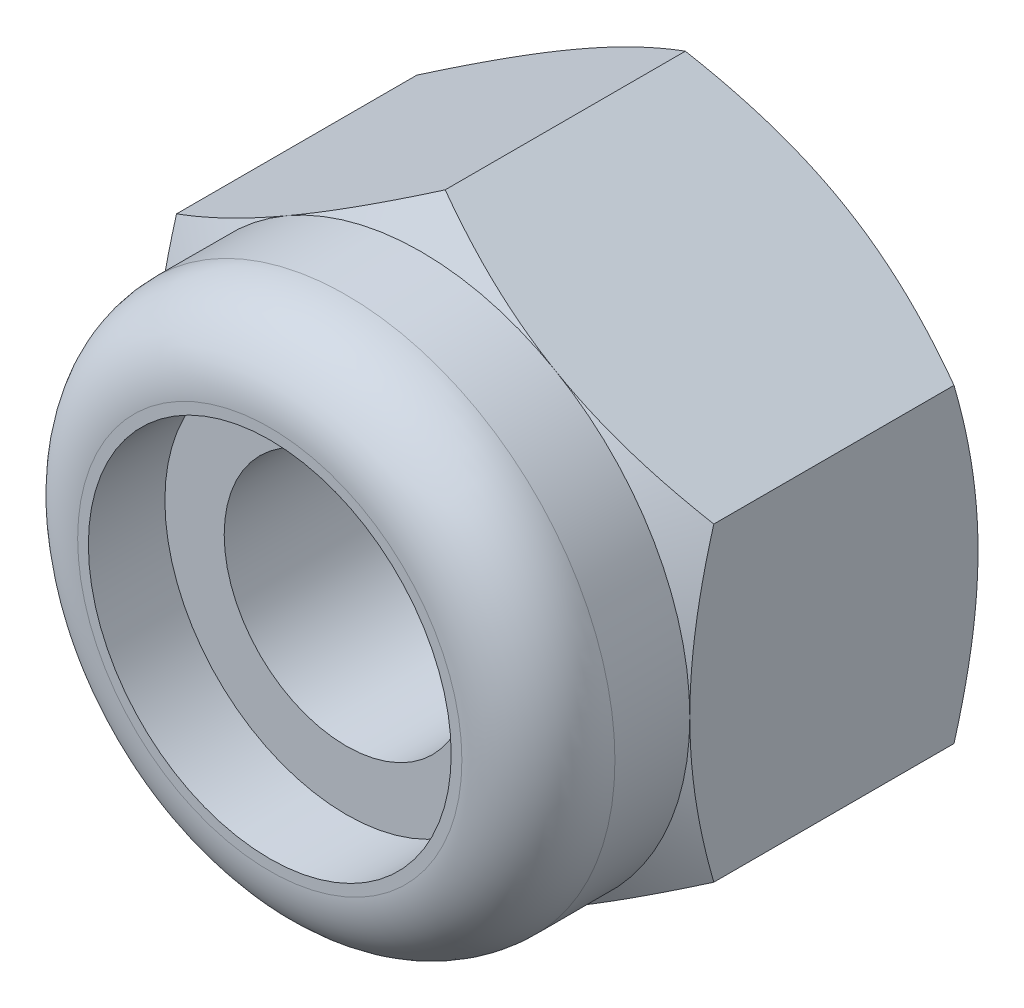
ISO-10303-21;
HEADER;
FILE_DESCRIPTION(('STEP AP214'),'2;1');
FILE_NAME('part.step','',(''),(''),'','','');
FILE_SCHEMA(('AUTOMOTIVE_DESIGN { 1 0 10303 214 1 1 1 1 }'));
ENDSEC;
DATA;
#1=APPLICATION_CONTEXT('core data for automotive mechanical design processes');
#2=APPLICATION_PROTOCOL_DEFINITION('international standard','automotive_design',2000,#1);
#3=PRODUCT_CONTEXT('',#1,'mechanical');
#4=PRODUCT('Part','Part','',(#3));
#5=PRODUCT_RELATED_PRODUCT_CATEGORY('part','',(#4));
#6=PRODUCT_DEFINITION_FORMATION('','',#4);
#7=PRODUCT_DEFINITION_CONTEXT('part definition',#1,'design');
#8=PRODUCT_DEFINITION('design','',#6,#7);
#9=PRODUCT_DEFINITION_SHAPE('','',#8);
#10=(LENGTH_UNIT() NAMED_UNIT(*) SI_UNIT(.MILLI.,.METRE.));
#11=(NAMED_UNIT(*) PLANE_ANGLE_UNIT() SI_UNIT($,.RADIAN.));
#12=(NAMED_UNIT(*) SI_UNIT($,.STERADIAN.) SOLID_ANGLE_UNIT());
#13=UNCERTAINTY_MEASURE_WITH_UNIT(LENGTH_MEASURE(1.E-05),#10,'distance_accuracy_value','');
#14=(GEOMETRIC_REPRESENTATION_CONTEXT(3) GLOBAL_UNCERTAINTY_ASSIGNED_CONTEXT((#13)) GLOBAL_UNIT_ASSIGNED_CONTEXT((#10,
#11,#12)) REPRESENTATION_CONTEXT('',''));
#15=CARTESIAN_POINT('',(0.,0.,0.));
#16=DIRECTION('',(0.,0.,1.));
#17=DIRECTION('',(1.,0.,0.));
#18=AXIS2_PLACEMENT_3D('',#15,#16,#17);
#19=CARTESIAN_POINT('',(0.,0.,-2.15));
#20=DIRECTION('',(0.,0.,1.));
#21=DIRECTION('',(1.,0.,0.));
#22=AXIS2_PLACEMENT_3D('',#19,#20,#21);
#23=CYLINDRICAL_SURFACE('',#22,1.25);
#24=CARTESIAN_POINT('',(0.,0.,1.56666666666667));
#25=DIRECTION('',(0.,0.,1.));
#26=DIRECTION('',(1.,0.,0.));
#27=AXIS2_PLACEMENT_3D('',#24,#25,#26);
#28=CIRCLE('',#27,1.25);
#29=CARTESIAN_POINT('',(1.25,0.,1.56666666666667));
#30=VERTEX_POINT('',#29);
#31=EDGE_CURVE('E389',#30,#30,#28,.T.);
#32=ORIENTED_EDGE('',*,*,#31,.T.);
#33=EDGE_LOOP('',(#32));
#34=FACE_BOUND('',#33,.T.);
#35=CARTESIAN_POINT('',(0.,0.,-1.94954811544757));
#36=DIRECTION('',(0.,0.,-1.));
#37=DIRECTION('',(-1.,0.,0.));
#38=AXIS2_PLACEMENT_3D('',#35,#36,#37);
#39=CIRCLE('',#38,1.25);
#40=CARTESIAN_POINT('',(-1.25,0.,-1.94954811544757));
#41=VERTEX_POINT('',#40);
#42=EDGE_CURVE('E207',#41,#41,#39,.F.);
#43=ORIENTED_EDGE('',*,*,#42,.F.);
#44=EDGE_LOOP('',(#43));
#45=FACE_BOUND('',#44,.T.);
#46=ADVANCED_FACE('F45',(#34,#45),#23,.F.);
#47=CARTESIAN_POINT('',(0.,3.17542648054295,-2.15));
#48=DIRECTION('',(-0.5,0.866025403784438,0.));
#49=DIRECTION('',(-0.866025403784438,-0.5,0.));
#50=AXIS2_PLACEMENT_3D('',#47,#48,#49);
#51=PLANE('',#50);
#52=DIRECTION('',(0.,0.,1.));
#53=VECTOR('',#52,1.);
#54=CARTESIAN_POINT('',(-2.75,1.58771324027147,-2.15));
#55=LINE('',#54,#53);
#56=CARTESIAN_POINT('',(-2.75,1.58771324027148,-1.90437990693813));
#57=VERTEX_POINT('',#56);
#58=CARTESIAN_POINT('',(-2.75,1.58771324027147,0.554379906938138));
#59=VERTEX_POINT('',#58);
#60=EDGE_CURVE('E193',#57,#59,#55,.T.);
#61=ORIENTED_EDGE('',*,*,#60,.T.);
#62=CARTESIAN_POINT('',(-2.75,1.58771324027147,0.554379906938139));
#63=CARTESIAN_POINT('',(-2.6302066308482,1.6568759741984,0.594329737139828));
#64=CARTESIAN_POINT('',(-2.509365846914,1.72664343333189,0.630689842069858));
#65=CARTESIAN_POINT('',(-2.26662688052022,1.86678884092215,0.6939946691019));
#66=CARTESIAN_POINT('',(-2.14473934279069,1.93716064364116,0.720994395558883));
#67=CARTESIAN_POINT('',(-1.96071790577701,2.04340546983767,0.753166760880289));
#68=CARTESIAN_POINT('',(-1.89913099491315,2.07896268940348,0.762507004192575));
#69=CARTESIAN_POINT('',(-1.77567051838129,2.15024262876342,0.778194151320093));
#70=CARTESIAN_POINT('',(-1.71379695842668,2.18596534525894,0.784541114539224));
#71=CARTESIAN_POINT('',(-1.58949771719198,2.25772954564586,0.794106782080544));
#72=CARTESIAN_POINT('',(-1.52707094038672,2.29377166203902,0.797306663931051));
#73=CARTESIAN_POINT('',(-1.4021432417576,2.36589870247178,0.800446474149509));
#74=CARTESIAN_POINT('',(-1.33964230713022,2.4019836339035,0.800385718731819));
#75=CARTESIAN_POINT('',(-1.27717330955858,2.4380501264675,0.798661103323475));
#76=B_SPLINE_CURVE_WITH_KNOTS('',3,(#62,#63,#64,#65,#66,#67,#68,#69,#70,#71,#72,#73,#74,#75),
.UNSPECIFIED.,.F.,.F.,(4,2,2,2,2,2,4),(0.,0.432153638556045,0.861722968635905,1.07684052373622,
1.29195380948689,1.50834598747679,1.72478354507502),.UNSPECIFIED.);
#77=CARTESIAN_POINT('',(-1.37500000000867,2.3815698604022,0.799999999999999));
#78=VERTEX_POINT('',#77);
#79=EDGE_CURVE('E221',#59,#78,#76,.T.);
#80=ORIENTED_EDGE('',*,*,#79,.T.);
#81=CARTESIAN_POINT('',(0.,3.17542648054295,0.554379906938137));
#82=CARTESIAN_POINT('',(-0.1197933691518,3.10626374661602,0.594329737139826));
#83=CARTESIAN_POINT('',(-0.240634153085997,3.03649628748253,0.630689842069857));
#84=CARTESIAN_POINT('',(-0.483373119479775,2.89635087989227,0.693994669101898));
#85=CARTESIAN_POINT('',(-0.605260657209305,2.82597907717326,0.720994395558882));
#86=CARTESIAN_POINT('',(-0.789282094222992,2.71973425097675,0.753166760880288));
#87=CARTESIAN_POINT('',(-0.850869005086854,2.68417703141094,0.762507004192574));
#88=CARTESIAN_POINT('',(-0.974329481618705,2.612897092051,0.778194151320092));
#89=CARTESIAN_POINT('',(-1.03620304157332,2.57717437555548,0.784541114539224));
#90=CARTESIAN_POINT('',(-1.16050228280802,2.50541017516856,0.794106782080543));
#91=CARTESIAN_POINT('',(-1.22292905961328,2.4693680587754,0.797306663931051));
#92=CARTESIAN_POINT('',(-1.3478567582424,2.39724101834264,0.800446474149509));
#93=CARTESIAN_POINT('',(-1.41035769286978,2.36115608691092,0.800385718731819));
#94=CARTESIAN_POINT('',(-1.47282669044143,2.32508959434692,0.798661103323475));
#95=B_SPLINE_CURVE_WITH_KNOTS('',3,(#81,#82,#83,#84,#85,#86,#87,#88,#89,#90,#91,#92,#93,#94),
.UNSPECIFIED.,.F.,.F.,(4,2,2,2,2,2,4),(0.,0.432153638556046,0.861722968635908,1.07684052373623,
1.29195380948689,1.50834598747679,1.72478354507502),.UNSPECIFIED.);
#96=CARTESIAN_POINT('',(0.,3.17542648054295,0.554379906938135));
#97=VERTEX_POINT('',#96);
#98=EDGE_CURVE('E368',#78,#97,#95,.F.);
#99=ORIENTED_EDGE('',*,*,#98,.T.);
#100=DIRECTION('',(0.,0.,1.));
#101=VECTOR('',#100,1.);
#102=CARTESIAN_POINT('',(0.,3.17542648054295,-2.15));
#103=LINE('',#102,#101);
#104=CARTESIAN_POINT('',(0.,3.17542648054295,-1.90437990693813));
#105=VERTEX_POINT('',#104);
#106=EDGE_CURVE('E173',#105,#97,#103,.T.);
#107=ORIENTED_EDGE('',*,*,#106,.F.);
#108=CARTESIAN_POINT('',(-2.7502,1.58759777021763,-1.90431323663524));
#109=CARTESIAN_POINT('',(-2.6293507793401,1.65737010029699,-1.94461233775074));
#110=CARTESIAN_POINT('',(-2.50745839737737,1.72774469983533,-1.98126309740234));
#111=CARTESIAN_POINT('',(-2.26156287327211,1.86971254687003,-2.0452378170302));
#112=CARTESIAN_POINT('',(-2.13755536142615,1.94130831721583,-2.0725391443255));
#113=CARTESIAN_POINT('',(-1.89107720202406,2.08361254889599,-2.11503825470588));
#114=CARTESIAN_POINT('',(-1.76864448141258,2.15429911309864,-2.13051888137754));
#115=CARTESIAN_POINT('',(-1.52320285763109,2.29600490065923,-2.14900060263006));
#116=CARTESIAN_POINT('',(-1.40019484676709,2.36702360884404,-2.1520170005374));
#117=CARTESIAN_POINT('',(-1.17034121338921,2.49972966594897,-2.14574685457145));
#118=CARTESIAN_POINT('',(-1.06346120874598,2.56143686540073,-2.1379998457233));
#119=CARTESIAN_POINT('',(-0.850397532665251,2.68444923614047,-2.11344481893564));
#120=CARTESIAN_POINT('',(-0.744214598351111,2.74575398185008,-2.09662841034943));
#121=CARTESIAN_POINT('',(-0.530711510606815,2.86902004703207,-2.05458807765404));
#122=CARTESIAN_POINT('',(-0.423418383857144,2.93096576264319,-2.02918591931277));
#123=CARTESIAN_POINT('',(-0.210432520715947,3.05393320806134,-1.97153277416002));
#124=CARTESIAN_POINT('',(-0.104737054973346,3.11495651365996,-1.93929533670101));
#125=CARTESIAN_POINT('',(0.000200000000000757,3.17554195059679,-1.90431323663523));
#126=B_SPLINE_CURVE_WITH_KNOTS('',3,(#108,#109,#110,#111,#112,#113,#114,#115,#116,#117,#118,
#119,#120,#121,#122,#123,#124,#125),.UNSPECIFIED.,.F.,.F.,(4,2,2,2,2,2,2,2,4),(0.,
0.435912828725888,0.872873557116332,1.29901931904672,1.72464171213574,2.09526089052938,
2.46622354066375,2.84541551798558,3.22386274754525),.UNSPECIFIED.);
#127=CARTESIAN_POINT('',(-1.375,2.38156986040721,-2.15));
#128=VERTEX_POINT('',#127);
#129=EDGE_CURVE('E197',#128,#105,#126,.T.);
#130=ORIENTED_EDGE('',*,*,#129,.F.);
#131=EDGE_CURVE('E164',#57,#128,#126,.T.);
#132=ORIENTED_EDGE('',*,*,#131,.F.);
#133=EDGE_LOOP('',(#61,#80,#99,#107,#130,#132));
#134=FACE_BOUND('',#133,.T.);
#135=ADVANCED_FACE('F306',(#134),#51,.T.);
#136=CARTESIAN_POINT('',(2.75,1.58771324027146,-2.15));
#137=DIRECTION('',(0.5,0.866025403784438,0.));
#138=DIRECTION('',(-0.866025403784438,0.5,0.));
#139=AXIS2_PLACEMENT_3D('',#136,#137,#138);
#140=PLANE('',#139);
#141=ORIENTED_EDGE('',*,*,#106,.T.);
#142=CARTESIAN_POINT('',(0.,3.17542648054294,0.554379906938142));
#143=CARTESIAN_POINT('',(0.119793369151802,3.10626374661601,0.594329737139832));
#144=CARTESIAN_POINT('',(0.240634153085998,3.03649628748252,0.630689842069862));
#145=CARTESIAN_POINT('',(0.483373119479775,2.89635087989226,0.693994669101903));
#146=CARTESIAN_POINT('',(0.605260657209305,2.82597907717325,0.720994395558886));
#147=CARTESIAN_POINT('',(0.78928209422299,2.71973425097674,0.753166760880292));
#148=CARTESIAN_POINT('',(0.850869005086852,2.68417703141093,0.762507004192578));
#149=CARTESIAN_POINT('',(0.974329481618702,2.61289709205099,0.778194151320096));
#150=CARTESIAN_POINT('',(1.03620304157331,2.57717437555548,0.784541114539227));
#151=CARTESIAN_POINT('',(1.16050228280802,2.50541017516855,0.794106782080547));
#152=CARTESIAN_POINT('',(1.22292905961328,2.46936805877539,0.797306663931055));
#153=CARTESIAN_POINT('',(1.34785675824239,2.39724101834264,0.800446474149513));
#154=CARTESIAN_POINT('',(1.41035769286978,2.36115608691091,0.800385718731822));
#155=CARTESIAN_POINT('',(1.47282669044142,2.32508959434692,0.798661103323479));
#156=B_SPLINE_CURVE_WITH_KNOTS('',3,(#142,#143,#144,#145,#146,#147,#148,#149,#150,#151,#152,
#153,#154,#155),.UNSPECIFIED.,.F.,.F.,(4,2,2,2,2,2,4),(0.,0.432153638556044,0.861722968635903,
1.07684052373622,1.29195380948689,1.50834598747678,1.72478354507501),.UNSPECIFIED.);
#157=CARTESIAN_POINT('',(1.375,2.3815698604072,0.800000000000001));
#158=VERTEX_POINT('',#157);
#159=EDGE_CURVE('E371',#97,#158,#156,.T.);
#160=ORIENTED_EDGE('',*,*,#159,.T.);
#161=CARTESIAN_POINT('',(2.75,1.58771324027147,0.554379906938142));
#162=CARTESIAN_POINT('',(2.63020663084819,1.65687597419839,0.594329737139832));
#163=CARTESIAN_POINT('',(2.509365846914,1.72664343333189,0.630689842069862));
#164=CARTESIAN_POINT('',(2.26662688052022,1.86678884092214,0.693994669101903));
#165=CARTESIAN_POINT('',(2.14473934279069,1.93716064364115,0.720994395558887));
#166=CARTESIAN_POINT('',(1.96071790577701,2.04340546983766,0.753166760880292));
#167=CARTESIAN_POINT('',(1.89913099491314,2.07896268940347,0.762507004192578));
#168=CARTESIAN_POINT('',(1.77567051838129,2.15024262876341,0.778194151320096));
#169=CARTESIAN_POINT('',(1.71379695842668,2.18596534525893,0.784541114539227));
#170=CARTESIAN_POINT('',(1.58949771719198,2.25772954564585,0.794106782080547));
#171=CARTESIAN_POINT('',(1.52707094038672,2.29377166203901,0.797306663931055));
#172=CARTESIAN_POINT('',(1.4021432417576,2.36589870247177,0.800446474149513));
#173=CARTESIAN_POINT('',(1.33964230713022,2.40198363390349,0.800385718731822));
#174=CARTESIAN_POINT('',(1.27717330955858,2.43805012646749,0.798661103323479));
#175=B_SPLINE_CURVE_WITH_KNOTS('',3,(#161,#162,#163,#164,#165,#166,#167,#168,#169,#170,#171,
#172,#173,#174),.UNSPECIFIED.,.F.,.F.,(4,2,2,2,2,2,4),(0.,0.432153638556044,0.861722968635903,
1.07684052373622,1.29195380948688,1.50834598747678,1.72478354507501),.UNSPECIFIED.);
#176=CARTESIAN_POINT('',(2.75,1.58771324027146,0.554379906938139));
#177=VERTEX_POINT('',#176);
#178=EDGE_CURVE('E171',#158,#177,#175,.F.);
#179=ORIENTED_EDGE('',*,*,#178,.T.);
#180=DIRECTION('',(0.,0.,1.));
#181=VECTOR('',#180,1.);
#182=CARTESIAN_POINT('',(2.75,1.58771324027146,-2.15));
#183=LINE('',#182,#181);
#184=CARTESIAN_POINT('',(2.75,1.58771324027148,-1.90437990693813));
#185=VERTEX_POINT('',#184);
#186=EDGE_CURVE('E160',#185,#177,#183,.T.);
#187=ORIENTED_EDGE('',*,*,#186,.F.);
#188=CARTESIAN_POINT('',(-0.000199999999999,3.17554195059679,-1.90431323663523));
#189=CARTESIAN_POINT('',(0.120649220659904,3.10576962051743,-1.94461233775074));
#190=CARTESIAN_POINT('',(0.242541602622631,3.03539502097908,-1.98126309740234));
#191=CARTESIAN_POINT('',(0.488437126727889,2.89342717394438,-2.0452378170302));
#192=CARTESIAN_POINT('',(0.612444638573852,2.82183140359858,-2.0725391443255));
#193=CARTESIAN_POINT('',(0.858922797975941,2.67952717191842,-2.11503825470589));
#194=CARTESIAN_POINT('',(0.981355518587415,2.60884060771577,-2.13051888137755));
#195=CARTESIAN_POINT('',(1.22679714236891,2.46713482015518,-2.14900060263006));
#196=CARTESIAN_POINT('',(1.34980515323291,2.39611611197037,-2.1520170005374));
#197=CARTESIAN_POINT('',(1.57965878661079,2.26341005486544,-2.14574685457145));
#198=CARTESIAN_POINT('',(1.68653879125402,2.20170285541368,-2.1379998457233));
#199=CARTESIAN_POINT('',(1.89960246733475,2.07869048467394,-2.11344481893565));
#200=CARTESIAN_POINT('',(2.00578540164889,2.01738573896433,-2.09662841034943));
#201=CARTESIAN_POINT('',(2.21928848939318,1.89411967378234,-2.05458807765405));
#202=CARTESIAN_POINT('',(2.32658161614285,1.83217395817122,-2.02918591931277));
#203=CARTESIAN_POINT('',(2.53956747928405,1.70920651275307,-1.97153277416002));
#204=CARTESIAN_POINT('',(2.64526294502665,1.64818320715446,-1.93929533670102));
#205=CARTESIAN_POINT('',(2.7502,1.58759777021763,-1.90431323663524));
#206=B_SPLINE_CURVE_WITH_KNOTS('',3,(#188,#189,#190,#191,#192,#193,#194,#195,#196,#197,#198,
#199,#200,#201,#202,#203,#204,#205),.UNSPECIFIED.,.F.,.F.,(4,2,2,2,2,2,2,2,4),(0.,
0.43591282872589,0.872873557116335,1.29901931904672,1.72464171213574,2.09526089052938,
2.46622354066375,2.84541551798558,3.22386274754525),.UNSPECIFIED.);
#207=CARTESIAN_POINT('',(1.375,2.38156986040721,-2.15));
#208=VERTEX_POINT('',#207);
#209=EDGE_CURVE('E140',#208,#185,#206,.T.);
#210=ORIENTED_EDGE('',*,*,#209,.F.);
#211=EDGE_CURVE('E152',#105,#208,#206,.T.);
#212=ORIENTED_EDGE('',*,*,#211,.F.);
#213=EDGE_LOOP('',(#141,#160,#179,#187,#210,#212));
#214=FACE_BOUND('',#213,.T.);
#215=ADVANCED_FACE('F168',(#214),#140,.T.);
#216=CARTESIAN_POINT('',(2.75,1.58771324027146,-2.15));
#217=DIRECTION('',(-1.,0.,0.));
#218=DIRECTION('',(0.,0.,1.));
#219=AXIS2_PLACEMENT_3D('',#216,#217,#218);
#220=PLANE('',#219);
#221=CARTESIAN_POINT('',(2.75,-1.58771324027148,0.554379906938137));
#222=CARTESIAN_POINT('',(2.75,-1.44938777241763,0.594329737139828));
#223=CARTESIAN_POINT('',(2.75,-1.30985285415064,0.630689842069858));
#224=CARTESIAN_POINT('',(2.75,-1.02956203897012,0.693994669101899));
#225=CARTESIAN_POINT('',(2.75,-0.888818433532111,0.720994395558882));
#226=CARTESIAN_POINT('',(2.75,-0.676328781139084,0.753166760880289));
#227=CARTESIAN_POINT('',(2.75,-0.605214342007468,0.762507004192575));
#228=CARTESIAN_POINT('',(2.75,-0.462654463287581,0.778194151320093));
#229=CARTESIAN_POINT('',(2.75,-0.391209030296551,0.784541114539224));
#230=CARTESIAN_POINT('',(2.75,-0.247680629522705,0.794106782080544));
#231=CARTESIAN_POINT('',(2.75,-0.17559639673639,0.797306663931052));
#232=CARTESIAN_POINT('',(2.75,-0.0313423158708706,0.80044647414951));
#233=CARTESIAN_POINT('',(2.75,0.0408275469925773,0.80038571873182));
#234=CARTESIAN_POINT('',(2.75,0.112960532120567,0.798661103323477));
#235=B_SPLINE_CURVE_WITH_KNOTS('',3,(#221,#222,#223,#224,#225,#226,#227,#228,#229,#230,#231,
#232,#233,#234),.UNSPECIFIED.,.F.,.F.,(4,2,2,2,2,2,4),(0.,0.432153638556045,0.861722968635905,
1.07684052373622,1.29195380948689,1.50834598747678,1.72478354507502),.UNSPECIFIED.);
#236=CARTESIAN_POINT('',(2.75,-1.58771324027148,0.554379906938135));
#237=VERTEX_POINT('',#236);
#238=CARTESIAN_POINT('',(2.75,0.,0.8));
#239=VERTEX_POINT('',#238);
#240=EDGE_CURVE('E213',#237,#239,#235,.T.);
#241=ORIENTED_EDGE('',*,*,#240,.F.);
#242=DIRECTION('',(0.,0.,1.));
#243=VECTOR('',#242,1.);
#244=CARTESIAN_POINT('',(2.75,-1.58771324027148,-2.15));
#245=LINE('',#244,#243);
#246=CARTESIAN_POINT('',(2.75,-1.58771324027147,-1.90437990693813));
#247=VERTEX_POINT('',#246);
#248=EDGE_CURVE('E174',#247,#237,#245,.T.);
#249=ORIENTED_EDGE('',*,*,#248,.F.);
#250=CARTESIAN_POINT('',(2.75,-4.21084949309676,-0.834051560397058));
#251=CARTESIAN_POINT('',(2.75,-4.09010894214091,-0.892400063847755));
#252=CARTESIAN_POINT('',(2.75,-3.9690829206551,-0.950168534882412));
#253=CARTESIAN_POINT('',(2.75,-3.72630558284844,-1.06421396157695));
#254=CARTESIAN_POINT('',(2.75,-3.60455414536201,-1.12049065899753));
#255=CARTESIAN_POINT('',(2.75,-3.35951393034355,-1.23151755664724));
#256=CARTESIAN_POINT('',(2.75,-3.23622034236437,-1.28625717839416));
#257=CARTESIAN_POINT('',(2.75,-2.98861980138744,-1.39338522252354));
#258=CARTESIAN_POINT('',(2.75,-2.86431290161182,-1.44577376746323));
#259=CARTESIAN_POINT('',(2.75,-2.61294485887172,-1.54819642785387));
#260=CARTESIAN_POINT('',(2.75,-2.48586863815655,-1.59819374210161));
#261=CARTESIAN_POINT('',(2.75,-2.23021732171541,-1.6942725912154));
#262=CARTESIAN_POINT('',(2.75,-2.10164206103364,-1.74035369042303));
#263=CARTESIAN_POINT('',(2.75,-1.84305218799468,-1.82736192295377));
#264=CARTESIAN_POINT('',(2.75,-1.71304130052584,-1.86830001358611));
#265=CARTESIAN_POINT('',(2.75,-1.45117125062148,-1.94369269237565));
#266=CARTESIAN_POINT('',(2.75,-1.31931268690203,-1.97814933084723));
#267=CARTESIAN_POINT('',(2.75,-1.05365722480013,-2.03890632846909));
#268=CARTESIAN_POINT('',(2.75,-0.919859820217595,-2.06520451590488));
#269=CARTESIAN_POINT('',(2.75,-0.650651874037385,-2.10787396280339));
#270=CARTESIAN_POINT('',(2.75,-0.515241331013598,-2.12424521348946));
#271=CARTESIAN_POINT('',(2.75,-0.244373242869214,-2.14561250345976));
#272=CARTESIAN_POINT('',(2.75,-0.108921526377136,-2.15068055677322));
#273=CARTESIAN_POINT('',(2.75,0.161887058855131,-2.14917220436733));
#274=CARTESIAN_POINT('',(2.75,0.297243943089638,-2.14259882131445));
#275=CARTESIAN_POINT('',(2.75,0.52838543671754,-2.12189586995316));
#276=CARTESIAN_POINT('',(2.75,0.624425050137498,-2.11046235896981));
#277=CARTESIAN_POINT('',(2.75,0.815762399811541,-2.08247828038665));
#278=CARTESIAN_POINT('',(2.75,0.911060016631964,-2.06592690577232));
#279=CARTESIAN_POINT('',(2.75,1.19576218748916,-2.00946463872172));
#280=CARTESIAN_POINT('',(2.75,1.38383224738496,-1.96276014058271));
#281=CARTESIAN_POINT('',(2.75,1.66525048947485,-1.88220750296942));
#282=CARTESIAN_POINT('',(2.75,1.76006556248558,-1.8531966650045));
#283=CARTESIAN_POINT('',(2.75,1.94870609382215,-1.79230435109341));
#284=CARTESIAN_POINT('',(2.75,2.04253218553696,-1.7604248551215));
#285=CARTESIAN_POINT('',(2.75,2.22880240354984,-1.69445858181355));
#286=CARTESIAN_POINT('',(2.75,2.32125133588451,-1.66038523854447));
#287=CARTESIAN_POINT('',(2.75,2.50543192042628,-1.59023863176889));
#288=CARTESIAN_POINT('',(2.75,2.59716326539579,-1.55416455996268));
#289=CARTESIAN_POINT('',(2.75,2.68856293053345,-1.51728755800251));
#290=B_SPLINE_CURVE_WITH_KNOTS('',3,(#250,#251,#252,#253,#254,#255,#256,#257,#258,#259,#260,
#261,#262,#263,#264,#265,#266,#267,#268,#269,#270,#271,#272,#273,#274,#275,#276,#277,#278,#279,
#280,#281,#282,#283,#284,#285,#286,#287,#288,#289),.UNSPECIFIED.,.F.,.F.,(4,2,2,2,2,2,2,2,2,2,2,
2,2,2,2,2,2,2,2,4),(0.,0.402305607365937,0.804680408536998,1.20935783819118,1.61401414820819,
2.0236383818577,2.43330812457349,2.84208969479601,3.25074173456637,3.65950246109144,
4.06826354901184,4.47441284024651,4.88045669141172,5.17046846817546,5.46052599902453,
6.04107275309884,6.33851131304662,6.63574613017455,6.93130791005793,7.22698998004823),.UNSPECIFIED.);
#291=CARTESIAN_POINT('',(2.75,0.,-2.15));
#292=VERTEX_POINT('',#291);
#293=EDGE_CURVE('E162',#247,#292,#290,.T.);
#294=ORIENTED_EDGE('',*,*,#293,.T.);
#295=EDGE_CURVE('E143',#292,#185,#290,.T.);
#296=ORIENTED_EDGE('',*,*,#295,.T.);
#297=ORIENTED_EDGE('',*,*,#186,.T.);
#298=CARTESIAN_POINT('',(2.75,1.58771324027146,0.554379906938142));
#299=CARTESIAN_POINT('',(2.75,1.44938777241761,0.594329737139832));
#300=CARTESIAN_POINT('',(2.75,1.30985285415062,0.630689842069862));
#301=CARTESIAN_POINT('',(2.75,1.02956203897011,0.693994669101902));
#302=CARTESIAN_POINT('',(2.75,0.888818433532096,0.720994395558885));
#303=CARTESIAN_POINT('',(2.75,0.67632878113907,0.753166760880291));
#304=CARTESIAN_POINT('',(2.75,0.605214342007454,0.762507004192577));
#305=CARTESIAN_POINT('',(2.75,0.462654463287567,0.778194151320095));
#306=CARTESIAN_POINT('',(2.75,0.391209030296538,0.784541114539225));
#307=CARTESIAN_POINT('',(2.75,0.247680629522692,0.794106782080545));
#308=CARTESIAN_POINT('',(2.75,0.175596396736377,0.797306663931052));
#309=CARTESIAN_POINT('',(2.75,0.0313423158708582,0.80044647414951));
#310=CARTESIAN_POINT('',(2.75,-0.0408275469925895,0.80038571873182));
#311=CARTESIAN_POINT('',(2.75,-0.112960532120579,0.798661103323476));
#312=B_SPLINE_CURVE_WITH_KNOTS('',3,(#298,#299,#300,#301,#302,#303,#304,#305,#306,#307,#308,
#309,#310,#311),.UNSPECIFIED.,.F.,.F.,(4,2,2,2,2,2,4),(0.,0.432153638556043,0.861722968635902,
1.07684052373622,1.29195380948688,1.50834598747678,1.72478354507501),.UNSPECIFIED.);
#313=EDGE_CURVE('E247',#239,#177,#312,.F.);
#314=ORIENTED_EDGE('',*,*,#313,.F.);
#315=EDGE_LOOP('',(#241,#249,#294,#296,#297,#314));
#316=FACE_BOUND('',#315,.T.);
#317=ADVANCED_FACE('F158',(#316),#220,.F.);
#318=CARTESIAN_POINT('',(0.,-3.17542648054296,-2.15));
#319=DIRECTION('',(0.5,-0.866025403784438,0.));
#320=DIRECTION('',(0.866025403784438,0.5,0.));
#321=AXIS2_PLACEMENT_3D('',#318,#319,#320);
#322=PLANE('',#321);
#323=ORIENTED_EDGE('',*,*,#248,.T.);
#324=CARTESIAN_POINT('',(2.75,-1.58771324027148,0.554379906938137));
#325=CARTESIAN_POINT('',(2.63020663084819,-1.65687597419841,0.594329737139827));
#326=CARTESIAN_POINT('',(2.509365846914,-1.7266434333319,0.630689842069856));
#327=CARTESIAN_POINT('',(2.26662688052022,-1.86678884092216,0.693994669101897));
#328=CARTESIAN_POINT('',(2.14473934279069,-1.93716064364117,0.720994395558879));
#329=CARTESIAN_POINT('',(1.960717905777,-2.04340546983768,0.753166760880285));
#330=CARTESIAN_POINT('',(1.89913099491314,-2.07896268940349,0.762507004192571));
#331=CARTESIAN_POINT('',(1.77567051838129,-2.15024262876343,0.778194151320089));
#332=CARTESIAN_POINT('',(1.71379695842668,-2.18596534525895,0.78454111453922));
#333=CARTESIAN_POINT('',(1.58949771719198,-2.25772954564587,0.794106782080539));
#334=CARTESIAN_POINT('',(1.52707094038672,-2.29377166203903,0.797306663931046));
#335=CARTESIAN_POINT('',(1.4021432417576,-2.36589870247179,0.800446474149504));
#336=CARTESIAN_POINT('',(1.33964230713022,-2.40198363390351,0.800385718731813));
#337=CARTESIAN_POINT('',(1.27717330955857,-2.43805012646751,0.79866110332347));
#338=B_SPLINE_CURVE_WITH_KNOTS('',3,(#324,#325,#326,#327,#328,#329,#330,#331,#332,#333,#334,
#335,#336,#337),.UNSPECIFIED.,.F.,.F.,(4,2,2,2,2,2,4),(0.,0.432153638556045,0.861722968635906,
1.07684052373622,1.29195380948689,1.50834598747679,1.72478354507502),.UNSPECIFIED.);
#339=CARTESIAN_POINT('',(1.375,-2.38156986040721,0.799999999999997));
#340=VERTEX_POINT('',#339);
#341=EDGE_CURVE('E222',#237,#340,#338,.T.);
#342=ORIENTED_EDGE('',*,*,#341,.T.);
#343=CARTESIAN_POINT('',(0.,-3.17542648054296,0.554379906938133));
#344=CARTESIAN_POINT('',(0.119793369151805,-3.10626374661603,0.594329737139822));
#345=CARTESIAN_POINT('',(0.240634153086002,-3.03649628748253,0.630689842069852));
#346=CARTESIAN_POINT('',(0.48337311947978,-2.89635087989227,0.693994669101894));
#347=CARTESIAN_POINT('',(0.605260657209311,-2.82597907717327,0.720994395558878));
#348=CARTESIAN_POINT('',(0.789282094222997,-2.71973425097676,0.753166760880283));
#349=CARTESIAN_POINT('',(0.85086900508686,-2.68417703141095,0.762507004192569));
#350=CARTESIAN_POINT('',(0.974329481618711,-2.612897092051,0.778194151320087));
#351=CARTESIAN_POINT('',(1.03620304157332,-2.57717437555549,0.784541114539218));
#352=CARTESIAN_POINT('',(1.16050228280803,-2.50541017516856,0.794106782080538));
#353=CARTESIAN_POINT('',(1.22292905961329,-2.46936805877541,0.797306663931046));
#354=CARTESIAN_POINT('',(1.3478567582424,-2.39724101834265,0.800446474149504));
#355=CARTESIAN_POINT('',(1.41035769286979,-2.36115608691092,0.800385718731813));
#356=CARTESIAN_POINT('',(1.47282669044143,-2.32508959434693,0.79866110332347));
#357=B_SPLINE_CURVE_WITH_KNOTS('',3,(#343,#344,#345,#346,#347,#348,#349,#350,#351,#352,#353,
#354,#355,#356),.UNSPECIFIED.,.F.,.F.,(4,2,2,2,2,2,4),(0.,0.432153638556046,0.861722968635908,
1.07684052373623,1.29195380948689,1.50834598747679,1.72478354507502),.UNSPECIFIED.);
#358=CARTESIAN_POINT('',(0.,-3.17542648054296,0.55437990693813));
#359=VERTEX_POINT('',#358);
#360=EDGE_CURVE('E748',#340,#359,#357,.F.);
#361=ORIENTED_EDGE('',*,*,#360,.T.);
#362=DIRECTION('',(0.,0.,1.));
#363=VECTOR('',#362,1.);
#364=CARTESIAN_POINT('',(0.,-3.17542648054296,-2.15));
#365=LINE('',#364,#363);
#366=CARTESIAN_POINT('',(0.,-3.17542648054295,-1.90437990693813));
#367=VERTEX_POINT('',#366);
#368=EDGE_CURVE('E183',#367,#359,#365,.T.);
#369=ORIENTED_EDGE('',*,*,#368,.F.);
#370=CARTESIAN_POINT('',(2.7502,-1.58759777021764,-1.90431323663523));
#371=CARTESIAN_POINT('',(2.6293507793401,-1.657370100297,-1.94461233775073));
#372=CARTESIAN_POINT('',(2.50745839737737,-1.72774469983534,-1.98126309740233));
#373=CARTESIAN_POINT('',(2.26156287327211,-1.86971254687004,-2.04523781703019));
#374=CARTESIAN_POINT('',(2.13755536142615,-1.94130831721584,-2.0725391443255));
#375=CARTESIAN_POINT('',(1.89107720202406,-2.083612548896,-2.11503825470588));
#376=CARTESIAN_POINT('',(1.76864448141258,-2.15429911309865,-2.13051888137754));
#377=CARTESIAN_POINT('',(1.52320285763108,-2.29600490065924,-2.14900060263006));
#378=CARTESIAN_POINT('',(1.40019484676708,-2.36702360884405,-2.1520170005374));
#379=CARTESIAN_POINT('',(1.1703412133892,-2.49972966594898,-2.14574685457145));
#380=CARTESIAN_POINT('',(1.06346120874598,-2.56143686540074,-2.13799984572329));
#381=CARTESIAN_POINT('',(0.850397532665251,-2.68444923614048,-2.11344481893564));
#382=CARTESIAN_POINT('',(0.744214598351111,-2.74575398185009,-2.09662841034942));
#383=CARTESIAN_POINT('',(0.530711510606817,-2.86902004703208,-2.05458807765404));
#384=CARTESIAN_POINT('',(0.423418383857146,-2.9309657626432,-2.02918591931276));
#385=CARTESIAN_POINT('',(0.21043252071595,-3.05393320806135,-1.97153277416001));
#386=CARTESIAN_POINT('',(0.104737054973348,-3.11495651365996,-1.93929533670101));
#387=CARTESIAN_POINT('',(-0.000200000000000418,-3.17554195059679,-1.90431323663523));
#388=B_SPLINE_CURVE_WITH_KNOTS('',3,(#370,#371,#372,#373,#374,#375,#376,#377,#378,#379,#380,
#381,#382,#383,#384,#385,#386,#387),.UNSPECIFIED.,.F.,.F.,(4,2,2,2,2,2,2,2,4),(0.,
0.435912828725888,0.872873557116334,1.29901931904672,1.72464171213574,2.09526089052938,
2.46622354066375,2.84541551798557,3.22386274754524),.UNSPECIFIED.);
#389=CARTESIAN_POINT('',(1.375,-2.38156986040721,-2.15));
#390=VERTEX_POINT('',#389);
#391=EDGE_CURVE('E348',#390,#367,#388,.T.);
#392=ORIENTED_EDGE('',*,*,#391,.F.);
#393=EDGE_CURVE('E354',#247,#390,#388,.T.);
#394=ORIENTED_EDGE('',*,*,#393,.F.);
#395=EDGE_LOOP('',(#323,#342,#361,#369,#392,#394));
#396=FACE_BOUND('',#395,.T.);
#397=ADVANCED_FACE('F232',(#396),#322,.T.);
#398=CARTESIAN_POINT('',(-2.75,-1.58771324027147,-2.15));
#399=DIRECTION('',(-0.5,-0.866025403784438,0.));
#400=DIRECTION('',(0.866025403784438,-0.5,0.));
#401=AXIS2_PLACEMENT_3D('',#398,#399,#400);
#402=PLANE('',#401);
#403=ORIENTED_EDGE('',*,*,#368,.T.);
#404=CARTESIAN_POINT('',(0.,-3.17542648054295,0.554379906938135));
#405=CARTESIAN_POINT('',(-0.119793369151799,-3.10626374661602,0.594329737139825));
#406=CARTESIAN_POINT('',(-0.240634153085996,-3.03649628748253,0.630689842069855));
#407=CARTESIAN_POINT('',(-0.483373119479774,-2.89635087989227,0.693994669101897));
#408=CARTESIAN_POINT('',(-0.605260657209304,-2.82597907717327,0.72099439555888));
#409=CARTESIAN_POINT('',(-0.789282094222991,-2.71973425097675,0.753166760880287));
#410=CARTESIAN_POINT('',(-0.850869005086853,-2.68417703141094,0.762507004192573));
#411=CARTESIAN_POINT('',(-0.974329481618704,-2.612897092051,0.778194151320091));
#412=CARTESIAN_POINT('',(-1.03620304157331,-2.57717437555548,0.784541114539222));
#413=CARTESIAN_POINT('',(-1.16050228280802,-2.50541017516856,0.794106782080542));
#414=CARTESIAN_POINT('',(-1.22292905961328,-2.4693680587754,0.797306663931049));
#415=CARTESIAN_POINT('',(-1.3478567582424,-2.39724101834264,0.800446474149508));
#416=CARTESIAN_POINT('',(-1.41035769286978,-2.36115608691092,0.800385718731817));
#417=CARTESIAN_POINT('',(-1.47282669044142,-2.32508959434692,0.798661103323474));
#418=B_SPLINE_CURVE_WITH_KNOTS('',3,(#404,#405,#406,#407,#408,#409,#410,#411,#412,#413,#414,
#415,#416,#417),.UNSPECIFIED.,.F.,.F.,(4,2,2,2,2,2,4),(0.,0.432153638556046,0.861722968635908,
1.07684052373623,1.29195380948689,1.50834598747679,1.72478354507502),.UNSPECIFIED.);
#419=CARTESIAN_POINT('',(-1.375,-2.38156986040721,0.799999999999999));
#420=VERTEX_POINT('',#419);
#421=EDGE_CURVE('E742',#359,#420,#418,.T.);
#422=ORIENTED_EDGE('',*,*,#421,.T.);
#423=CARTESIAN_POINT('',(-2.75,-1.58771324027147,0.554379906938139));
#424=CARTESIAN_POINT('',(-2.63020663084819,-1.6568759741984,0.594329737139829));
#425=CARTESIAN_POINT('',(-2.509365846914,-1.7266434333319,0.630689842069859));
#426=CARTESIAN_POINT('',(-2.26662688052022,-1.86678884092215,0.6939946691019));
#427=CARTESIAN_POINT('',(-2.14473934279069,-1.93716064364116,0.720994395558883));
#428=CARTESIAN_POINT('',(-1.960717905777,-2.04340546983767,0.753166760880288));
#429=CARTESIAN_POINT('',(-1.89913099491314,-2.07896268940348,0.762507004192574));
#430=CARTESIAN_POINT('',(-1.77567051838129,-2.15024262876343,0.778194151320092));
#431=CARTESIAN_POINT('',(-1.71379695842668,-2.18596534525894,0.784541114539223));
#432=CARTESIAN_POINT('',(-1.58949771719198,-2.25772954564586,0.794106782080543));
#433=CARTESIAN_POINT('',(-1.52707094038672,-2.29377166203902,0.79730666393105));
#434=CARTESIAN_POINT('',(-1.4021432417576,-2.36589870247178,0.800446474149508));
#435=CARTESIAN_POINT('',(-1.33964230713022,-2.4019836339035,0.800385718731817));
#436=CARTESIAN_POINT('',(-1.27717330955857,-2.4380501264675,0.798661103323474));
#437=B_SPLINE_CURVE_WITH_KNOTS('',3,(#423,#424,#425,#426,#427,#428,#429,#430,#431,#432,#433,
#434,#435,#436),.UNSPECIFIED.,.F.,.F.,(4,2,2,2,2,2,4),(0.,0.432153638556044,0.861722968635905,
1.07684052373622,1.29195380948689,1.50834598747678,1.72478354507502),.UNSPECIFIED.);
#438=CARTESIAN_POINT('',(-2.75,-1.58771324027147,0.554379906938136));
#439=VERTEX_POINT('',#438);
#440=EDGE_CURVE('E719',#420,#439,#437,.F.);
#441=ORIENTED_EDGE('',*,*,#440,.T.);
#442=DIRECTION('',(0.,0.,1.));
#443=VECTOR('',#442,1.);
#444=CARTESIAN_POINT('',(-2.75,-1.58771324027147,-2.15));
#445=LINE('',#444,#443);
#446=CARTESIAN_POINT('',(-2.75,-1.58771324027148,-1.90437990693813));
#447=VERTEX_POINT('',#446);
#448=EDGE_CURVE('E189',#447,#439,#445,.T.);
#449=ORIENTED_EDGE('',*,*,#448,.F.);
#450=CARTESIAN_POINT('',(0.000199999999999436,-3.17554195059679,-1.90431323663523));
#451=CARTESIAN_POINT('',(-0.120649220659906,-3.10576962051743,-1.94461233775073));
#452=CARTESIAN_POINT('',(-0.242541602622633,-3.03539502097909,-1.98126309740233));
#453=CARTESIAN_POINT('',(-0.488437126727893,-2.89342717394439,-2.0452378170302));
#454=CARTESIAN_POINT('',(-0.612444638573856,-2.82183140359859,-2.0725391443255));
#455=CARTESIAN_POINT('',(-0.858922797975945,-2.67952717191843,-2.11503825470588));
#456=CARTESIAN_POINT('',(-0.981355518587419,-2.60884060771577,-2.13051888137754));
#457=CARTESIAN_POINT('',(-1.22679714236892,-2.46713482015519,-2.14900060263006));
#458=CARTESIAN_POINT('',(-1.34980515323292,-2.39611611197038,-2.1520170005374));
#459=CARTESIAN_POINT('',(-1.5796587866108,-2.26341005486545,-2.14574685457145));
#460=CARTESIAN_POINT('',(-1.68653879125403,-2.20170285541369,-2.1379998457233));
#461=CARTESIAN_POINT('',(-1.89960246733475,-2.07869048467395,-2.11344481893564));
#462=CARTESIAN_POINT('',(-2.00578540164889,-2.01738573896434,-2.09662841034943));
#463=CARTESIAN_POINT('',(-2.21928848939319,-1.89411967378235,-2.05458807765404));
#464=CARTESIAN_POINT('',(-2.32658161614286,-1.83217395817123,-2.02918591931277));
#465=CARTESIAN_POINT('',(-2.53956747928405,-1.70920651275308,-1.97153277416002));
#466=CARTESIAN_POINT('',(-2.64526294502665,-1.64818320715447,-1.93929533670102));
#467=CARTESIAN_POINT('',(-2.7502,-1.58759777021764,-1.90431323663524));
#468=B_SPLINE_CURVE_WITH_KNOTS('',3,(#450,#451,#452,#453,#454,#455,#456,#457,#458,#459,#460,
#461,#462,#463,#464,#465,#466,#467),.UNSPECIFIED.,.F.,.F.,(4,2,2,2,2,2,2,2,4),(0.,
0.43591282872589,0.872873557116336,1.29901931904672,1.72464171213574,2.09526089052938,
2.46622354066375,2.84541551798557,3.22386274754524),.UNSPECIFIED.);
#469=CARTESIAN_POINT('',(-1.375,-2.38156986040721,-2.15));
#470=VERTEX_POINT('',#469);
#471=EDGE_CURVE('E342',#470,#447,#468,.T.);
#472=ORIENTED_EDGE('',*,*,#471,.F.);
#473=EDGE_CURVE('E355',#367,#470,#468,.T.);
#474=ORIENTED_EDGE('',*,*,#473,.F.);
#475=EDGE_LOOP('',(#403,#422,#441,#449,#472,#474));
#476=FACE_BOUND('',#475,.T.);
#477=ADVANCED_FACE('F443',(#476),#402,.T.);
#478=CARTESIAN_POINT('',(-2.75,1.58771324027147,-2.15));
#479=DIRECTION('',(-1.,0.,0.));
#480=DIRECTION('',(0.,0.,1.));
#481=AXIS2_PLACEMENT_3D('',#478,#479,#480);
#482=PLANE('',#481);
#483=ORIENTED_EDGE('',*,*,#448,.T.);
#484=CARTESIAN_POINT('',(-2.75,-1.58771324027148,0.554379906938138));
#485=CARTESIAN_POINT('',(-2.75,-1.44938777241762,0.594329737139829));
#486=CARTESIAN_POINT('',(-2.75,-1.30985285415063,0.630689842069859));
#487=CARTESIAN_POINT('',(-2.75,-1.02956203897012,0.6939946691019));
#488=CARTESIAN_POINT('',(-2.75,-0.888818433532106,0.720994395558883));
#489=CARTESIAN_POINT('',(-2.75,-0.67632878113908,0.753166760880289));
#490=CARTESIAN_POINT('',(-2.75,-0.605214342007463,0.762507004192576));
#491=CARTESIAN_POINT('',(-2.75,-0.462654463287576,0.778194151320094));
#492=CARTESIAN_POINT('',(-2.75,-0.391209030296547,0.784541114539225));
#493=CARTESIAN_POINT('',(-2.75,-0.2476806295227,0.794106782080544));
#494=CARTESIAN_POINT('',(-2.75,-0.175596396736386,0.797306663931052));
#495=CARTESIAN_POINT('',(-2.75,-0.0313423158708663,0.80044647414951));
#496=CARTESIAN_POINT('',(-2.75,0.0408275469925816,0.80038571873182));
#497=CARTESIAN_POINT('',(-2.75,0.112960532120571,0.798661103323477));
#498=B_SPLINE_CURVE_WITH_KNOTS('',3,(#484,#485,#486,#487,#488,#489,#490,#491,#492,#493,#494,
#495,#496,#497),.UNSPECIFIED.,.F.,.F.,(4,2,2,2,2,2,4),(0.,0.432153638556045,0.861722968635905,
1.07684052373622,1.29195380948689,1.50834598747678,1.72478354507502),.UNSPECIFIED.);
#499=CARTESIAN_POINT('',(-2.75,0.,0.8));
#500=VERTEX_POINT('',#499);
#501=EDGE_CURVE('E715',#439,#500,#498,.T.);
#502=ORIENTED_EDGE('',*,*,#501,.T.);
#503=CARTESIAN_POINT('',(-2.75,1.58771324027147,0.554379906938139));
#504=CARTESIAN_POINT('',(-2.75,1.44938777241762,0.594329737139829));
#505=CARTESIAN_POINT('',(-2.75,1.30985285415063,0.630689842069859));
#506=CARTESIAN_POINT('',(-2.75,1.02956203897011,0.693994669101901));
#507=CARTESIAN_POINT('',(-2.75,0.888818433532105,0.720994395558884));
#508=CARTESIAN_POINT('',(-2.75,0.676328781139077,0.75316676088029));
#509=CARTESIAN_POINT('',(-2.75,0.605214342007461,0.762507004192576));
#510=CARTESIAN_POINT('',(-2.75,0.462654463287574,0.778194151320094));
#511=CARTESIAN_POINT('',(-2.75,0.391209030296544,0.784541114539225));
#512=CARTESIAN_POINT('',(-2.75,0.247680629522697,0.794106782080544));
#513=CARTESIAN_POINT('',(-2.75,0.175596396736382,0.797306663931052));
#514=CARTESIAN_POINT('',(-2.75,0.0313423158708626,0.80044647414951));
#515=CARTESIAN_POINT('',(-2.75,-0.0408275469925854,0.80038571873182));
#516=CARTESIAN_POINT('',(-2.75,-0.112960532120575,0.798661103323476));
#517=B_SPLINE_CURVE_WITH_KNOTS('',3,(#503,#504,#505,#506,#507,#508,#509,#510,#511,#512,#513,
#514,#515,#516),.UNSPECIFIED.,.F.,.F.,(4,2,2,2,2,2,4),(0.,0.432153638556045,0.861722968635906,
1.07684052373622,1.29195380948689,1.50834598747679,1.72478354507502),.UNSPECIFIED.);
#518=EDGE_CURVE('E264',#500,#59,#517,.F.);
#519=ORIENTED_EDGE('',*,*,#518,.T.);
#520=ORIENTED_EDGE('',*,*,#60,.F.);
#521=CARTESIAN_POINT('',(-2.75,-4.21084949309676,-0.834051560397059));
#522=CARTESIAN_POINT('',(-2.75,-4.0901089421409,-0.892400063847756));
#523=CARTESIAN_POINT('',(-2.75,-3.96908292065509,-0.950168534882413));
#524=CARTESIAN_POINT('',(-2.75,-3.72630558284844,-1.06421396157695));
#525=CARTESIAN_POINT('',(-2.75,-3.604554145362,-1.12049065899753));
#526=CARTESIAN_POINT('',(-2.75,-3.35951393034355,-1.23151755664724));
#527=CARTESIAN_POINT('',(-2.75,-3.23622034236437,-1.28625717839416));
#528=CARTESIAN_POINT('',(-2.75,-2.98861980138744,-1.39338522252354));
#529=CARTESIAN_POINT('',(-2.75,-2.86431290161182,-1.44577376746324));
#530=CARTESIAN_POINT('',(-2.75,-2.61294485887172,-1.54819642785388));
#531=CARTESIAN_POINT('',(-2.75,-2.48586863815654,-1.59819374210161));
#532=CARTESIAN_POINT('',(-2.75,-2.23021732171541,-1.6942725912154));
#533=CARTESIAN_POINT('',(-2.75,-2.10164206103364,-1.74035369042303));
#534=CARTESIAN_POINT('',(-2.75,-1.84305218799467,-1.82736192295377));
#535=CARTESIAN_POINT('',(-2.75,-1.71304130052584,-1.86830001358611));
#536=CARTESIAN_POINT('',(-2.75,-1.45117125062148,-1.94369269237565));
#537=CARTESIAN_POINT('',(-2.75,-1.31931268690202,-1.97814933084723));
#538=CARTESIAN_POINT('',(-2.75,-1.05365722480013,-2.03890632846909));
#539=CARTESIAN_POINT('',(-2.75,-0.919859820217593,-2.06520451590488));
#540=CARTESIAN_POINT('',(-2.75,-0.650651874037383,-2.10787396280339));
#541=CARTESIAN_POINT('',(-2.75,-0.515241331013596,-2.12424521348946));
#542=CARTESIAN_POINT('',(-2.75,-0.244373242869212,-2.14561250345976));
#543=CARTESIAN_POINT('',(-2.75,-0.108921526377135,-2.15068055677322));
#544=CARTESIAN_POINT('',(-2.75,0.161887058855133,-2.14917220436733));
#545=CARTESIAN_POINT('',(-2.75,0.297243943089639,-2.14259882131445));
#546=CARTESIAN_POINT('',(-2.75,0.528385436717541,-2.12189586995316));
#547=CARTESIAN_POINT('',(-2.75,0.624425050137499,-2.11046235896981));
#548=CARTESIAN_POINT('',(-2.75,0.815762399811543,-2.08247828038665));
#549=CARTESIAN_POINT('',(-2.75,0.911060016631965,-2.06592690577232));
#550=CARTESIAN_POINT('',(-2.75,1.19576218748916,-2.00946463872172));
#551=CARTESIAN_POINT('',(-2.75,1.38383224738497,-1.96276014058271));
#552=CARTESIAN_POINT('',(-2.75,1.66525048947485,-1.88220750296942));
#553=CARTESIAN_POINT('',(-2.75,1.76006556248558,-1.8531966650045));
#554=CARTESIAN_POINT('',(-2.75,1.94870609382215,-1.79230435109341));
#555=CARTESIAN_POINT('',(-2.75,2.04253218553696,-1.7604248551215));
#556=CARTESIAN_POINT('',(-2.75,2.22880240354985,-1.69445858181355));
#557=CARTESIAN_POINT('',(-2.75,2.32125133588452,-1.66038523854447));
#558=CARTESIAN_POINT('',(-2.75,2.50543192042629,-1.59023863176889));
#559=CARTESIAN_POINT('',(-2.75,2.59716326539579,-1.55416455996268));
#560=CARTESIAN_POINT('',(-2.75,2.68856293053346,-1.51728755800251));
#561=B_SPLINE_CURVE_WITH_KNOTS('',3,(#521,#522,#523,#524,#525,#526,#527,#528,#529,#530,#531,
#532,#533,#534,#535,#536,#537,#538,#539,#540,#541,#542,#543,#544,#545,#546,#547,#548,#549,#550,
#551,#552,#553,#554,#555,#556,#557,#558,#559,#560),.UNSPECIFIED.,.F.,.F.,(4,2,2,2,2,2,2,2,2,2,2,
2,2,2,2,2,2,2,2,4),(0.,0.402305607365936,0.804680408536996,1.20935783819118,1.61401414820818,
2.0236383818577,2.43330812457349,2.842089694796,3.25074173456636,3.65950246109144,
4.06826354901184,4.4744128402465,4.88045669141172,5.17046846817546,5.46052599902452,
6.04107275309883,6.33851131304662,6.63574613017455,6.93130791005793,7.22698998004823),.UNSPECIFIED.);
#562=CARTESIAN_POINT('',(-2.75,0.,-2.15));
#563=VERTEX_POINT('',#562);
#564=EDGE_CURVE('E300',#563,#57,#561,.T.);
#565=ORIENTED_EDGE('',*,*,#564,.F.);
#566=EDGE_CURVE('E362',#447,#563,#561,.T.);
#567=ORIENTED_EDGE('',*,*,#566,.F.);
#568=EDGE_LOOP('',(#483,#502,#519,#520,#565,#567));
#569=FACE_BOUND('',#568,.T.);
#570=ADVANCED_FACE('F450',(#569),#482,.T.);
#571=CARTESIAN_POINT('',(0.,3.17542648054295,-2.15));
#572=DIRECTION('',(0.,0.,-1.));
#573=DIRECTION('',(-1.,0.,0.));
#574=AXIS2_PLACEMENT_3D('',#571,#572,#573);
#575=PLANE('',#574);
#576=CARTESIAN_POINT('',(0.,0.,-2.15));
#577=DIRECTION('',(0.,0.,-1.));
#578=DIRECTION('',(-1.,0.,0.));
#579=AXIS2_PLACEMENT_3D('',#576,#577,#578);
#580=CIRCLE('',#579,1.5);
#581=CARTESIAN_POINT('',(-1.5,0.,-2.15));
#582=VERTEX_POINT('',#581);
#583=EDGE_CURVE('E203',#582,#582,#580,.F.);
#584=ORIENTED_EDGE('',*,*,#583,.T.);
#585=EDGE_LOOP('',(#584));
#586=FACE_BOUND('',#585,.T.);
#587=CARTESIAN_POINT('',(0.,0.,-2.15));
#588=DIRECTION('',(0.,0.,-1.));
#589=DIRECTION('',(-1.,0.,0.));
#590=AXIS2_PLACEMENT_3D('',#587,#588,#589);
#591=CIRCLE('',#590,2.75);
#592=EDGE_CURVE('E202',#563,#470,#591,.F.);
#593=ORIENTED_EDGE('',*,*,#592,.F.);
#594=EDGE_CURVE('E179',#128,#563,#591,.F.);
#595=ORIENTED_EDGE('',*,*,#594,.F.);
#596=EDGE_CURVE('E201',#208,#128,#591,.F.);
#597=ORIENTED_EDGE('',*,*,#596,.F.);
#598=CARTESIAN_POINT('',(0.,0.,-2.15));
#599=DIRECTION('',(0.,0.,1.));
#600=DIRECTION('',(1.,0.,0.));
#601=AXIS2_PLACEMENT_3D('',#598,#599,#600);
#602=CIRCLE('',#601,2.75);
#603=EDGE_CURVE('E146',#292,#208,#602,.T.);
#604=ORIENTED_EDGE('',*,*,#603,.F.);
#605=EDGE_CURVE('E282',#390,#292,#591,.F.);
#606=ORIENTED_EDGE('',*,*,#605,.F.);
#607=EDGE_CURVE('E274',#470,#390,#591,.F.);
#608=ORIENTED_EDGE('',*,*,#607,.F.);
#609=EDGE_LOOP('',(#593,#595,#597,#604,#606,#608));
#610=FACE_BOUND('',#609,.T.);
#611=ADVANCED_FACE('F304',(#586,#610),#575,.T.);
#612=CARTESIAN_POINT('',(0.,0.,-2.15));
#613=DIRECTION('',(0.,0.,1.));
#614=DIRECTION('',(1.,0.,0.));
#615=AXIS2_PLACEMENT_3D('',#612,#613,#614);
#616=CONICAL_SURFACE('',#615,2.75,1.0471975511966);
#617=ORIENTED_EDGE('',*,*,#131,.T.);
#618=ORIENTED_EDGE('',*,*,#594,.T.);
#619=ORIENTED_EDGE('',*,*,#564,.T.);
#620=EDGE_LOOP('',(#617,#618,#619));
#621=FACE_BOUND('',#620,.T.);
#622=ADVANCED_FACE('F298',(#621),#616,.T.);
#623=ORIENTED_EDGE('',*,*,#129,.T.);
#624=ORIENTED_EDGE('',*,*,#211,.T.);
#625=ORIENTED_EDGE('',*,*,#596,.T.);
#626=EDGE_LOOP('',(#623,#624,#625));
#627=FACE_BOUND('',#626,.T.);
#628=ADVANCED_FACE('F292',(#627),#616,.T.);
#629=ORIENTED_EDGE('',*,*,#209,.T.);
#630=ORIENTED_EDGE('',*,*,#295,.F.);
#631=ORIENTED_EDGE('',*,*,#603,.T.);
#632=EDGE_LOOP('',(#629,#630,#631));
#633=FACE_BOUND('',#632,.T.);
#634=ADVANCED_FACE('F142',(#633),#616,.T.);
#635=ORIENTED_EDGE('',*,*,#393,.T.);
#636=ORIENTED_EDGE('',*,*,#605,.T.);
#637=ORIENTED_EDGE('',*,*,#293,.F.);
#638=EDGE_LOOP('',(#635,#636,#637));
#639=FACE_BOUND('',#638,.T.);
#640=ADVANCED_FACE('F469',(#639),#616,.T.);
#641=ORIENTED_EDGE('',*,*,#391,.T.);
#642=ORIENTED_EDGE('',*,*,#473,.T.);
#643=ORIENTED_EDGE('',*,*,#607,.T.);
#644=EDGE_LOOP('',(#641,#642,#643));
#645=FACE_BOUND('',#644,.T.);
#646=ADVANCED_FACE('F328',(#645),#616,.T.);
#647=ORIENTED_EDGE('',*,*,#471,.T.);
#648=ORIENTED_EDGE('',*,*,#566,.T.);
#649=ORIENTED_EDGE('',*,*,#592,.T.);
#650=EDGE_LOOP('',(#647,#648,#649));
#651=FACE_BOUND('',#650,.T.);
#652=ADVANCED_FACE('F322',(#651),#616,.T.);
#653=CARTESIAN_POINT('',(0.,0.,0.8));
#654=DIRECTION('',(0.,0.,-1.));
#655=DIRECTION('',(-1.,0.,0.));
#656=AXIS2_PLACEMENT_3D('',#653,#654,#655);
#657=CONICAL_SURFACE('',#656,2.75,1.0471975511966);
#658=CARTESIAN_POINT('',(0.,0.,0.8));
#659=DIRECTION('',(0.,0.,-1.));
#660=DIRECTION('',(-1.,0.,0.));
#661=AXIS2_PLACEMENT_3D('',#658,#659,#660);
#662=CIRCLE('',#661,2.75);
#663=EDGE_CURVE('E80',#420,#500,#662,.T.);
#664=ORIENTED_EDGE('',*,*,#663,.T.);
#665=ORIENTED_EDGE('',*,*,#501,.F.);
#666=ORIENTED_EDGE('',*,*,#440,.F.);
#667=EDGE_LOOP('',(#664,#665,#666));
#668=FACE_BOUND('',#667,.T.);
#669=ADVANCED_FACE('F327',(#668),#657,.T.);
#670=CARTESIAN_POINT('',(0.,0.,0.8));
#671=DIRECTION('',(0.,0.,-1.));
#672=DIRECTION('',(-1.,0.,0.));
#673=AXIS2_PLACEMENT_3D('',#670,#671,#672);
#674=CIRCLE('',#673,2.75);
#675=EDGE_CURVE('E50',#340,#420,#674,.T.);
#676=ORIENTED_EDGE('',*,*,#675,.T.);
#677=ORIENTED_EDGE('',*,*,#421,.F.);
#678=ORIENTED_EDGE('',*,*,#360,.F.);
#679=EDGE_LOOP('',(#676,#677,#678));
#680=FACE_BOUND('',#679,.T.);
#681=ADVANCED_FACE('F499',(#680),#657,.T.);
#682=ORIENTED_EDGE('',*,*,#240,.T.);
#683=CARTESIAN_POINT('',(0.,0.,0.8));
#684=DIRECTION('',(0.,0.,-1.));
#685=DIRECTION('',(-1.,0.,0.));
#686=AXIS2_PLACEMENT_3D('',#683,#684,#685);
#687=CIRCLE('',#686,2.75);
#688=EDGE_CURVE('E89',#239,#340,#687,.T.);
#689=ORIENTED_EDGE('',*,*,#688,.T.);
#690=ORIENTED_EDGE('',*,*,#341,.F.);
#691=EDGE_LOOP('',(#682,#689,#690));
#692=FACE_BOUND('',#691,.T.);
#693=ADVANCED_FACE('F47',(#692),#657,.T.);
#694=CARTESIAN_POINT('',(0.,0.,0.8));
#695=DIRECTION('',(0.,0.,1.));
#696=DIRECTION('',(1.,0.,0.));
#697=AXIS2_PLACEMENT_3D('',#694,#695,#696);
#698=CIRCLE('',#697,2.75);
#699=EDGE_CURVE('E212',#239,#158,#698,.T.);
#700=ORIENTED_EDGE('',*,*,#699,.F.);
#701=ORIENTED_EDGE('',*,*,#313,.T.);
#702=ORIENTED_EDGE('',*,*,#178,.F.);
#703=EDGE_LOOP('',(#700,#701,#702));
#704=FACE_BOUND('',#703,.T.);
#705=ADVANCED_FACE('F512',(#704),#657,.T.);
#706=CARTESIAN_POINT('',(0.,0.,0.8));
#707=DIRECTION('',(0.,0.,-1.));
#708=DIRECTION('',(-1.,0.,0.));
#709=AXIS2_PLACEMENT_3D('',#706,#707,#708);
#710=CIRCLE('',#709,2.75);
#711=EDGE_CURVE('E57',#78,#158,#710,.T.);
#712=ORIENTED_EDGE('',*,*,#711,.T.);
#713=ORIENTED_EDGE('',*,*,#159,.F.);
#714=ORIENTED_EDGE('',*,*,#98,.F.);
#715=EDGE_LOOP('',(#712,#713,#714));
#716=FACE_BOUND('',#715,.T.);
#717=ADVANCED_FACE('F519',(#716),#657,.T.);
#718=ORIENTED_EDGE('',*,*,#518,.F.);
#719=CARTESIAN_POINT('',(0.,0.,0.8));
#720=DIRECTION('',(0.,0.,-1.));
#721=DIRECTION('',(-1.,0.,0.));
#722=AXIS2_PLACEMENT_3D('',#719,#720,#721);
#723=CIRCLE('',#722,2.75);
#724=EDGE_CURVE('E12',#500,#78,#723,.T.);
#725=ORIENTED_EDGE('',*,*,#724,.T.);
#726=ORIENTED_EDGE('',*,*,#79,.F.);
#727=EDGE_LOOP('',(#718,#725,#726));
#728=FACE_BOUND('',#727,.T.);
#729=ADVANCED_FACE('F500',(#728),#657,.T.);
#730=CARTESIAN_POINT('',(0.,0.,-2.1246));
#731=DIRECTION('',(0.,0.,-1.));
#732=DIRECTION('',(-1.,0.,0.));
#733=AXIS2_PLACEMENT_3D('',#730,#731,#732);
#734=CONICAL_SURFACE('',#733,1.5,0.959931088596876);
#735=CARTESIAN_POINT('',(0.,0.,-2.1246));
#736=DIRECTION('',(0.,0.,1.));
#737=DIRECTION('',(1.,0.,0.));
#738=AXIS2_PLACEMENT_3D('',#735,#736,#737);
#739=CIRCLE('',#738,1.5);
#740=CARTESIAN_POINT('',(1.5,0.,-2.1246));
#741=VERTEX_POINT('',#740);
#742=EDGE_CURVE('E208',#741,#741,#739,.T.);
#743=ORIENTED_EDGE('',*,*,#742,.F.);
#744=EDGE_LOOP('',(#743));
#745=FACE_BOUND('',#744,.T.);
#746=ORIENTED_EDGE('',*,*,#42,.T.);
#747=EDGE_LOOP('',(#746));
#748=FACE_BOUND('',#747,.T.);
#749=ADVANCED_FACE('F532',(#745,#748),#734,.F.);
#750=CARTESIAN_POINT('',(0.,0.,-25.0375057290932));
#751=DIRECTION('',(0.,0.,1.));
#752=DIRECTION('',(1.,0.,0.));
#753=AXIS2_PLACEMENT_3D('',#750,#751,#752);
#754=CYLINDRICAL_SURFACE('',#753,1.5);
#755=ORIENTED_EDGE('',*,*,#583,.F.);
#756=EDGE_LOOP('',(#755));
#757=FACE_BOUND('',#756,.T.);
#758=ORIENTED_EDGE('',*,*,#742,.T.);
#759=EDGE_LOOP('',(#758));
#760=FACE_BOUND('',#759,.T.);
#761=ADVANCED_FACE('F329',(#757,#760),#754,.F.);
#762=CARTESIAN_POINT('',(0.,1.25,1.56666666666667));
#763=DIRECTION('',(0.,0.,-1.));
#764=DIRECTION('',(-1.,0.,0.));
#765=AXIS2_PLACEMENT_3D('',#762,#763,#764);
#766=PLANE('',#765);
#767=ORIENTED_EDGE('',*,*,#31,.F.);
#768=EDGE_LOOP('',(#767));
#769=FACE_BOUND('',#768,.T.);
#770=CARTESIAN_POINT('',(0.,0.,1.56666666666667));
#771=DIRECTION('',(0.,0.,1.));
#772=DIRECTION('',(1.,0.,0.));
#773=AXIS2_PLACEMENT_3D('',#770,#771,#772);
#774=CIRCLE('',#773,1.85714285714286);
#775=CARTESIAN_POINT('',(1.85714285714286,0.,1.56666666666667));
#776=VERTEX_POINT('',#775);
#777=EDGE_CURVE('E376',#776,#776,#774,.T.);
#778=ORIENTED_EDGE('',*,*,#777,.T.);
#779=EDGE_LOOP('',(#778));
#780=FACE_BOUND('',#779,.T.);
#781=ADVANCED_FACE('F395',(#769,#780),#766,.F.);
#782=CARTESIAN_POINT('',(0.,0.,9.48088822457563));
#783=DIRECTION('',(0.,0.,1.));
#784=DIRECTION('',(1.,0.,0.));
#785=AXIS2_PLACEMENT_3D('',#782,#783,#784);
#786=CYLINDRICAL_SURFACE('',#785,1.85714285714286);
#787=ORIENTED_EDGE('',*,*,#777,.F.);
#788=EDGE_LOOP('',(#787));
#789=FACE_BOUND('',#788,.T.);
#790=CARTESIAN_POINT('',(0.,0.,2.35));
#791=DIRECTION('',(0.,0.,1.));
#792=DIRECTION('',(1.,0.,0.));
#793=AXIS2_PLACEMENT_3D('',#790,#791,#792);
#794=CIRCLE('',#793,1.85714285714286);
#795=CARTESIAN_POINT('',(1.85714285714286,0.,2.35));
#796=VERTEX_POINT('',#795);
#797=EDGE_CURVE('E379',#796,#796,#794,.T.);
#798=ORIENTED_EDGE('',*,*,#797,.T.);
#799=EDGE_LOOP('',(#798));
#800=FACE_BOUND('',#799,.T.);
#801=ADVANCED_FACE('F398',(#789,#800),#786,.F.);
#802=CARTESIAN_POINT('',(0.,1.85714285714286,2.35));
#803=DIRECTION('',(0.,0.,-1.));
#804=DIRECTION('',(-1.,0.,0.));
#805=AXIS2_PLACEMENT_3D('',#802,#803,#804);
#806=PLANE('',#805);
#807=ORIENTED_EDGE('',*,*,#797,.F.);
#808=EDGE_LOOP('',(#807));
#809=FACE_BOUND('',#808,.T.);
#810=CARTESIAN_POINT('',(0.,0.,2.35));
#811=DIRECTION('',(0.,0.,1.));
#812=DIRECTION('',(1.,0.,0.));
#813=AXIS2_PLACEMENT_3D('',#810,#811,#812);
#814=CIRCLE('',#813,1.96666666666667);
#815=CARTESIAN_POINT('',(1.96666666666667,0.,2.35));
#816=VERTEX_POINT('',#815);
#817=EDGE_CURVE('E383',#816,#816,#814,.T.);
#818=ORIENTED_EDGE('',*,*,#817,.T.);
#819=EDGE_LOOP('',(#818));
#820=FACE_BOUND('',#819,.T.);
#821=ADVANCED_FACE('F404',(#809,#820),#806,.F.);
#822=CARTESIAN_POINT('',(0.,0.,1.56666666666667));
#823=DIRECTION('',(0.,0.,1.));
#824=DIRECTION('',(1.,0.,0.));
#825=AXIS2_PLACEMENT_3D('',#822,#823,#824);
#826=TOROIDAL_SURFACE('',#825,1.96666666666667,0.783333333333333);
#827=ORIENTED_EDGE('',*,*,#817,.F.);
#828=EDGE_LOOP('',(#827));
#829=FACE_BOUND('',#828,.T.);
#830=CARTESIAN_POINT('',(0.,0.,1.56666666666667));
#831=DIRECTION('',(0.,0.,1.));
#832=DIRECTION('',(1.,0.,0.));
#833=AXIS2_PLACEMENT_3D('',#830,#831,#832);
#834=CIRCLE('',#833,2.75);
#835=CARTESIAN_POINT('',(2.75,0.,1.56666666666667));
#836=VERTEX_POINT('',#835);
#837=EDGE_CURVE('E386',#836,#836,#834,.T.);
#838=ORIENTED_EDGE('',*,*,#837,.T.);
#839=EDGE_LOOP('',(#838));
#840=FACE_BOUND('',#839,.T.);
#841=ADVANCED_FACE('F410',(#829,#840),#826,.T.);
#842=CARTESIAN_POINT('',(0.,0.,9.48088822457563));
#843=DIRECTION('',(0.,0.,1.));
#844=DIRECTION('',(1.,0.,0.));
#845=AXIS2_PLACEMENT_3D('',#842,#843,#844);
#846=CYLINDRICAL_SURFACE('',#845,2.75);
#847=ORIENTED_EDGE('',*,*,#663,.F.);
#848=ORIENTED_EDGE('',*,*,#675,.F.);
#849=ORIENTED_EDGE('',*,*,#688,.F.);
#850=ORIENTED_EDGE('',*,*,#699,.T.);
#851=ORIENTED_EDGE('',*,*,#711,.F.);
#852=ORIENTED_EDGE('',*,*,#724,.F.);
#853=EDGE_LOOP('',(#847,#848,#849,#850,#851,#852));
#854=FACE_BOUND('',#853,.T.);
#855=ORIENTED_EDGE('',*,*,#837,.F.);
#856=EDGE_LOOP('',(#855));
#857=FACE_BOUND('',#856,.T.);
#858=ADVANCED_FACE('F416',(#854,#857),#846,.T.);
#859=CLOSED_SHELL('',(#46,#135,#215,#317,#397,#477,#570,#611,#622,#628,#634,#640,#646,#652,#669,
#681,#693,#705,#717,#729,#749,#761,#781,#801,#821,#841,#858));
#860=MANIFOLD_SOLID_BREP('B2',#859);
#861=ADVANCED_BREP_SHAPE_REPRESENTATION('',(#18,#860),#14);
#862=SHAPE_DEFINITION_REPRESENTATION(#9,#861);
ENDSEC;
END-ISO-10303-21;
